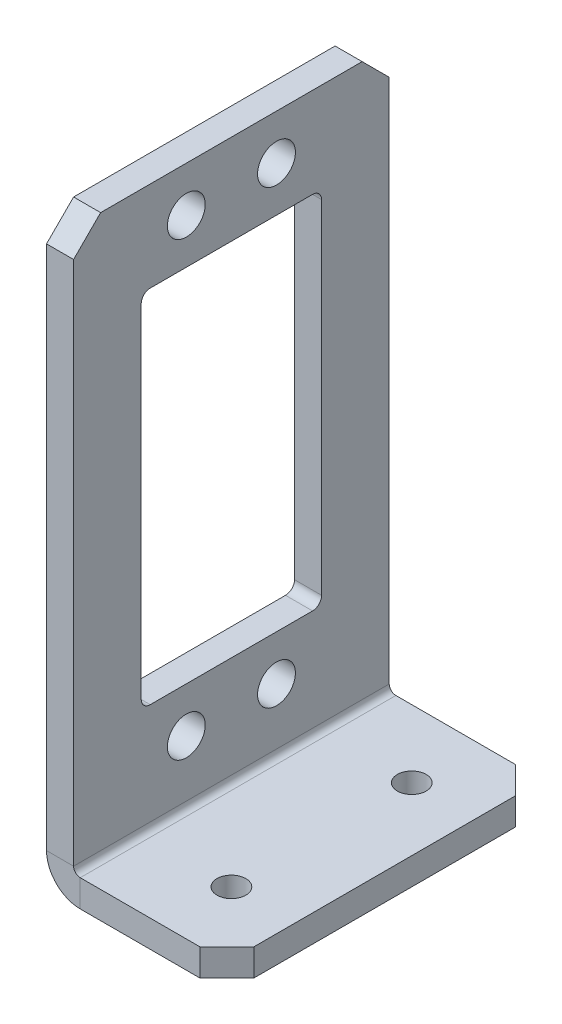
ISO-10303-21;
HEADER;
FILE_DESCRIPTION(('STEP AP214'),'2;1');
FILE_NAME('part.step','',(''),(''),'','','');
FILE_SCHEMA(('AUTOMOTIVE_DESIGN { 1 0 10303 214 1 1 1 1 }'));
ENDSEC;
DATA;
#1=APPLICATION_CONTEXT('core data for automotive mechanical design processes');
#2=APPLICATION_PROTOCOL_DEFINITION('international standard','automotive_design',2000,#1);
#3=PRODUCT_CONTEXT('',#1,'mechanical');
#4=PRODUCT('Part','Part','',(#3));
#5=PRODUCT_RELATED_PRODUCT_CATEGORY('part','',(#4));
#6=PRODUCT_DEFINITION_FORMATION('','',#4);
#7=PRODUCT_DEFINITION_CONTEXT('part definition',#1,'design');
#8=PRODUCT_DEFINITION('design','',#6,#7);
#9=PRODUCT_DEFINITION_SHAPE('','',#8);
#10=(LENGTH_UNIT() NAMED_UNIT(*) SI_UNIT(.MILLI.,.METRE.));
#11=(NAMED_UNIT(*) PLANE_ANGLE_UNIT() SI_UNIT($,.RADIAN.));
#12=(NAMED_UNIT(*) SI_UNIT($,.STERADIAN.) SOLID_ANGLE_UNIT());
#13=UNCERTAINTY_MEASURE_WITH_UNIT(LENGTH_MEASURE(1.E-05),#10,'distance_accuracy_value','');
#14=(GEOMETRIC_REPRESENTATION_CONTEXT(3) GLOBAL_UNCERTAINTY_ASSIGNED_CONTEXT((#13)) GLOBAL_UNIT_ASSIGNED_CONTEXT((#10,
#11,#12)) REPRESENTATION_CONTEXT('',''));
#15=CARTESIAN_POINT('',(0.,0.,0.));
#16=DIRECTION('',(0.,0.,1.));
#17=DIRECTION('',(1.,0.,0.));
#18=AXIS2_PLACEMENT_3D('',#15,#16,#17);
#19=CARTESIAN_POINT('',(20.,9.99999999999999,22.5));
#20=DIRECTION('',(-1.,0.,0.));
#21=DIRECTION('',(0.,0.,1.));
#22=AXIS2_PLACEMENT_3D('',#19,#20,#21);
#23=CYLINDRICAL_SURFACE('',#22,2.1);
#24=CARTESIAN_POINT('',(0.,9.99999999999999,22.5));
#25=DIRECTION('',(-1.,0.,0.));
#26=DIRECTION('',(0.,0.,1.));
#27=AXIS2_PLACEMENT_3D('',#24,#25,#26);
#28=CIRCLE('',#27,2.1);
#29=CARTESIAN_POINT('',(0.,9.99999999999999,24.6));
#30=VERTEX_POINT('',#29);
#31=EDGE_CURVE('E306',#30,#30,#28,.T.);
#32=ORIENTED_EDGE('',*,*,#31,.T.);
#33=EDGE_LOOP('',(#32));
#34=FACE_BOUND('',#33,.T.);
#35=CARTESIAN_POINT('',(3.,9.99999999999999,22.5));
#36=DIRECTION('',(-1.,0.,0.));
#37=DIRECTION('',(0.,0.,1.));
#38=AXIS2_PLACEMENT_3D('',#35,#36,#37);
#39=CIRCLE('',#38,2.1);
#40=CARTESIAN_POINT('',(3.,9.99999999999999,24.6));
#41=VERTEX_POINT('',#40);
#42=EDGE_CURVE('E309',#41,#41,#39,.T.);
#43=ORIENTED_EDGE('',*,*,#42,.F.);
#44=EDGE_LOOP('',(#43));
#45=FACE_BOUND('',#44,.T.);
#46=ADVANCED_FACE('F41',(#34,#45),#23,.F.);
#47=CARTESIAN_POINT('',(20.,9.99999999999999,12.5));
#48=DIRECTION('',(-1.,0.,0.));
#49=DIRECTION('',(0.,0.,1.));
#50=AXIS2_PLACEMENT_3D('',#47,#48,#49);
#51=CYLINDRICAL_SURFACE('',#50,2.1);
#52=CARTESIAN_POINT('',(0.,9.99999999999999,12.5));
#53=DIRECTION('',(-1.,0.,0.));
#54=DIRECTION('',(0.,0.,1.));
#55=AXIS2_PLACEMENT_3D('',#52,#53,#54);
#56=CIRCLE('',#55,2.1);
#57=CARTESIAN_POINT('',(0.,9.99999999999999,14.6));
#58=VERTEX_POINT('',#57);
#59=EDGE_CURVE('E300',#58,#58,#56,.T.);
#60=ORIENTED_EDGE('',*,*,#59,.T.);
#61=EDGE_LOOP('',(#60));
#62=FACE_BOUND('',#61,.T.);
#63=CARTESIAN_POINT('',(3.,9.99999999999999,12.5));
#64=DIRECTION('',(-1.,0.,0.));
#65=DIRECTION('',(0.,0.,1.));
#66=AXIS2_PLACEMENT_3D('',#63,#64,#65);
#67=CIRCLE('',#66,2.1);
#68=CARTESIAN_POINT('',(3.,9.99999999999999,14.6));
#69=VERTEX_POINT('',#68);
#70=EDGE_CURVE('E303',#69,#69,#67,.T.);
#71=ORIENTED_EDGE('',*,*,#70,.F.);
#72=EDGE_LOOP('',(#71));
#73=FACE_BOUND('',#72,.T.);
#74=ADVANCED_FACE('F426',(#62,#73),#51,.F.);
#75=CARTESIAN_POINT('',(0.,3.7366,35.));
#76=DIRECTION('',(0.,0.,1.));
#77=DIRECTION('',(1.,0.,0.));
#78=AXIS2_PLACEMENT_3D('',#75,#76,#77);
#79=PLANE('',#78);
#80=DIRECTION('',(1.,0.,0.));
#81=VECTOR('',#80,1.);
#82=CARTESIAN_POINT('',(0.,3.7366,35.));
#83=LINE('',#82,#81);
#84=CARTESIAN_POINT('',(0.,3.7366,35.));
#85=VERTEX_POINT('',#84);
#86=CARTESIAN_POINT('',(3.,3.7366,35.));
#87=VERTEX_POINT('',#86);
#88=EDGE_CURVE('E179',#85,#87,#83,.T.);
#89=ORIENTED_EDGE('',*,*,#88,.F.);
#90=CARTESIAN_POINT('',(3.7366,3.7366,35.));
#91=DIRECTION('',(0.,0.,1.));
#92=DIRECTION('',(1.,0.,0.));
#93=AXIS2_PLACEMENT_3D('',#90,#91,#92);
#94=CIRCLE('',#93,3.7366);
#95=CARTESIAN_POINT('',(3.7366,0.,35.));
#96=VERTEX_POINT('',#95);
#97=EDGE_CURVE('E184',#96,#85,#94,.F.);
#98=ORIENTED_EDGE('',*,*,#97,.F.);
#99=DIRECTION('',(0.,-1.,0.));
#100=VECTOR('',#99,1.);
#101=CARTESIAN_POINT('',(3.7366,3.,35.));
#102=LINE('',#101,#100);
#103=CARTESIAN_POINT('',(3.7366,3.,35.));
#104=VERTEX_POINT('',#103);
#105=EDGE_CURVE('E192',#104,#96,#102,.T.);
#106=ORIENTED_EDGE('',*,*,#105,.F.);
#107=CARTESIAN_POINT('',(3.7366,3.7366,35.));
#108=DIRECTION('',(0.,0.,1.));
#109=DIRECTION('',(1.,0.,0.));
#110=AXIS2_PLACEMENT_3D('',#107,#108,#109);
#111=CIRCLE('',#110,0.7366);
#112=EDGE_CURVE('E186',#104,#87,#111,.F.);
#113=ORIENTED_EDGE('',*,*,#112,.T.);
#114=EDGE_LOOP('',(#89,#98,#106,#113));
#115=FACE_BOUND('',#114,.T.);
#116=ADVANCED_FACE('F181',(#115),#79,.T.);
#117=CARTESIAN_POINT('',(3.7366,3.,35.));
#118=DIRECTION('',(0.,0.,1.));
#119=DIRECTION('',(1.,0.,0.));
#120=AXIS2_PLACEMENT_3D('',#117,#118,#119);
#121=PLANE('',#120);
#122=DIRECTION('',(0.,1.,0.));
#123=VECTOR('',#122,1.);
#124=CARTESIAN_POINT('',(3.,0.,35.));
#125=LINE('',#124,#123);
#126=CARTESIAN_POINT('',(3.,62.,35.));
#127=VERTEX_POINT('',#126);
#128=EDGE_CURVE('E215',#87,#127,#125,.T.);
#129=ORIENTED_EDGE('',*,*,#128,.T.);
#130=DIRECTION('',(-1.,0.,0.));
#131=VECTOR('',#130,1.);
#132=CARTESIAN_POINT('',(3.7366,62.,35.));
#133=LINE('',#132,#131);
#134=CARTESIAN_POINT('',(0.,62.,35.));
#135=VERTEX_POINT('',#134);
#136=EDGE_CURVE('E214',#127,#135,#133,.T.);
#137=ORIENTED_EDGE('',*,*,#136,.T.);
#138=DIRECTION('',(0.,1.,0.));
#139=VECTOR('',#138,1.);
#140=CARTESIAN_POINT('',(0.,0.,35.));
#141=LINE('',#140,#139);
#142=EDGE_CURVE('E202',#85,#135,#141,.T.);
#143=ORIENTED_EDGE('',*,*,#142,.F.);
#144=ORIENTED_EDGE('',*,*,#88,.T.);
#145=EDGE_LOOP('',(#129,#137,#143,#144));
#146=FACE_BOUND('',#145,.T.);
#147=ADVANCED_FACE('F212',(#146),#121,.T.);
#148=CARTESIAN_POINT('',(3.7366,0.,0.));
#149=DIRECTION('',(0.,0.,-1.));
#150=DIRECTION('',(-1.,0.,0.));
#151=AXIS2_PLACEMENT_3D('',#148,#149,#150);
#152=PLANE('',#151);
#153=DIRECTION('',(0.,1.,0.));
#154=VECTOR('',#153,1.);
#155=CARTESIAN_POINT('',(3.7366,0.,0.));
#156=LINE('',#155,#154);
#157=CARTESIAN_POINT('',(3.7366,0.,0.));
#158=VERTEX_POINT('',#157);
#159=CARTESIAN_POINT('',(3.7366,3.,0.));
#160=VERTEX_POINT('',#159);
#161=EDGE_CURVE('E261',#158,#160,#156,.T.);
#162=ORIENTED_EDGE('',*,*,#161,.F.);
#163=CARTESIAN_POINT('',(3.7366,3.7366,0.));
#164=DIRECTION('',(0.,0.,1.));
#165=DIRECTION('',(1.,0.,0.));
#166=AXIS2_PLACEMENT_3D('',#163,#164,#165);
#167=CIRCLE('',#166,3.7366);
#168=CARTESIAN_POINT('',(0.,3.7366,0.));
#169=VERTEX_POINT('',#168);
#170=EDGE_CURVE('E234',#158,#169,#167,.F.);
#171=ORIENTED_EDGE('',*,*,#170,.T.);
#172=DIRECTION('',(-1.,0.,0.));
#173=VECTOR('',#172,1.);
#174=CARTESIAN_POINT('',(3.,3.7366,0.));
#175=LINE('',#174,#173);
#176=CARTESIAN_POINT('',(3.,3.7366,0.));
#177=VERTEX_POINT('',#176);
#178=EDGE_CURVE('E259',#177,#169,#175,.T.);
#179=ORIENTED_EDGE('',*,*,#178,.F.);
#180=CARTESIAN_POINT('',(3.7366,3.7366,0.));
#181=DIRECTION('',(0.,0.,1.));
#182=DIRECTION('',(1.,0.,0.));
#183=AXIS2_PLACEMENT_3D('',#180,#181,#182);
#184=CIRCLE('',#183,0.7366);
#185=EDGE_CURVE('E240',#160,#177,#184,.F.);
#186=ORIENTED_EDGE('',*,*,#185,.F.);
#187=EDGE_LOOP('',(#162,#171,#179,#186));
#188=FACE_BOUND('',#187,.T.);
#189=ADVANCED_FACE('F413',(#188),#152,.T.);
#190=CARTESIAN_POINT('',(3.,3.7366,0.));
#191=DIRECTION('',(0.,0.,-1.));
#192=DIRECTION('',(-1.,0.,0.));
#193=AXIS2_PLACEMENT_3D('',#190,#191,#192);
#194=PLANE('',#193);
#195=DIRECTION('',(1.,0.,0.));
#196=VECTOR('',#195,1.);
#197=CARTESIAN_POINT('',(0.,3.,0.));
#198=LINE('',#197,#196);
#199=CARTESIAN_POINT('',(17.,3.,0.));
#200=VERTEX_POINT('',#199);
#201=EDGE_CURVE('E238',#200,#160,#198,.F.);
#202=ORIENTED_EDGE('',*,*,#201,.F.);
#203=DIRECTION('',(0.,-1.,0.));
#204=VECTOR('',#203,1.);
#205=CARTESIAN_POINT('',(17.,3.7366,0.));
#206=LINE('',#205,#204);
#207=CARTESIAN_POINT('',(17.,0.,0.));
#208=VERTEX_POINT('',#207);
#209=EDGE_CURVE('E297',#200,#208,#206,.T.);
#210=ORIENTED_EDGE('',*,*,#209,.T.);
#211=DIRECTION('',(-1.,0.,0.));
#212=VECTOR('',#211,1.);
#213=CARTESIAN_POINT('',(0.,0.,0.));
#214=LINE('',#213,#212);
#215=EDGE_CURVE('E236',#208,#158,#214,.T.);
#216=ORIENTED_EDGE('',*,*,#215,.T.);
#217=ORIENTED_EDGE('',*,*,#161,.T.);
#218=EDGE_LOOP('',(#202,#210,#216,#217));
#219=FACE_BOUND('',#218,.T.);
#220=ADVANCED_FACE('F419',(#219),#194,.T.);
#221=CARTESIAN_POINT('',(3.,0.,35.));
#222=DIRECTION('',(-1.,0.,0.));
#223=DIRECTION('',(0.,0.,1.));
#224=AXIS2_PLACEMENT_3D('',#221,#222,#223);
#225=PLANE('',#224);
#226=DIRECTION('',(0.,1.,0.));
#227=VECTOR('',#226,1.);
#228=CARTESIAN_POINT('',(3.,0.,27.5));
#229=LINE('',#228,#227);
#230=CARTESIAN_POINT('',(3.,16.,27.5));
#231=VERTEX_POINT('',#230);
#232=CARTESIAN_POINT('',(3.,54.,27.5));
#233=VERTEX_POINT('',#232);
#234=EDGE_CURVE('E371',#231,#233,#229,.T.);
#235=ORIENTED_EDGE('',*,*,#234,.T.);
#236=CARTESIAN_POINT('',(3.,54.,26.5));
#237=DIRECTION('',(-1.,0.,0.));
#238=DIRECTION('',(0.,0.,1.));
#239=AXIS2_PLACEMENT_3D('',#236,#237,#238);
#240=CIRCLE('',#239,1.);
#241=CARTESIAN_POINT('',(3.,55.,26.5));
#242=VERTEX_POINT('',#241);
#243=EDGE_CURVE('E63',#233,#242,#240,.T.);
#244=ORIENTED_EDGE('',*,*,#243,.T.);
#245=DIRECTION('',(0.,0.,-1.));
#246=VECTOR('',#245,1.);
#247=CARTESIAN_POINT('',(3.,55.,35.));
#248=LINE('',#247,#246);
#249=CARTESIAN_POINT('',(3.,55.,8.50000000000002));
#250=VERTEX_POINT('',#249);
#251=EDGE_CURVE('E362',#242,#250,#248,.T.);
#252=ORIENTED_EDGE('',*,*,#251,.T.);
#253=CARTESIAN_POINT('',(3.,54.,8.50000000000002));
#254=DIRECTION('',(-1.,0.,0.));
#255=DIRECTION('',(0.,0.,1.));
#256=AXIS2_PLACEMENT_3D('',#253,#254,#255);
#257=CIRCLE('',#256,1.);
#258=CARTESIAN_POINT('',(3.,54.,7.50000000000002));
#259=VERTEX_POINT('',#258);
#260=EDGE_CURVE('E11',#250,#259,#257,.T.);
#261=ORIENTED_EDGE('',*,*,#260,.T.);
#262=DIRECTION('',(0.,-1.,0.));
#263=VECTOR('',#262,1.);
#264=CARTESIAN_POINT('',(3.,0.,7.50000000000002));
#265=LINE('',#264,#263);
#266=CARTESIAN_POINT('',(3.,16.,7.50000000000002));
#267=VERTEX_POINT('',#266);
#268=EDGE_CURVE('E360',#259,#267,#265,.T.);
#269=ORIENTED_EDGE('',*,*,#268,.T.);
#270=CARTESIAN_POINT('',(3.,16.,8.50000000000002));
#271=DIRECTION('',(-1.,0.,0.));
#272=DIRECTION('',(0.,0.,1.));
#273=AXIS2_PLACEMENT_3D('',#270,#271,#272);
#274=CIRCLE('',#273,1.);
#275=CARTESIAN_POINT('',(3.,15.,8.50000000000002));
#276=VERTEX_POINT('',#275);
#277=EDGE_CURVE('E337',#267,#276,#274,.T.);
#278=ORIENTED_EDGE('',*,*,#277,.T.);
#279=DIRECTION('',(0.,0.,1.));
#280=VECTOR('',#279,1.);
#281=CARTESIAN_POINT('',(3.,15.,35.));
#282=LINE('',#281,#280);
#283=CARTESIAN_POINT('',(3.,15.,26.5));
#284=VERTEX_POINT('',#283);
#285=EDGE_CURVE('E352',#276,#284,#282,.T.);
#286=ORIENTED_EDGE('',*,*,#285,.T.);
#287=CARTESIAN_POINT('',(3.,16.,26.5));
#288=DIRECTION('',(-1.,0.,0.));
#289=DIRECTION('',(0.,0.,1.));
#290=AXIS2_PLACEMENT_3D('',#287,#288,#289);
#291=CIRCLE('',#290,1.);
#292=EDGE_CURVE('E333',#284,#231,#291,.T.);
#293=ORIENTED_EDGE('',*,*,#292,.T.);
#294=EDGE_LOOP('',(#235,#244,#252,#261,#269,#278,#286,#293));
#295=FACE_BOUND('',#294,.T.);
#296=CARTESIAN_POINT('',(3.,60.,22.5));
#297=DIRECTION('',(-1.,0.,0.));
#298=DIRECTION('',(0.,0.,1.));
#299=AXIS2_PLACEMENT_3D('',#296,#297,#298);
#300=CIRCLE('',#299,2.1);
#301=CARTESIAN_POINT('',(3.,60.,24.6));
#302=VERTEX_POINT('',#301);
#303=EDGE_CURVE('E369',#302,#302,#300,.T.);
#304=ORIENTED_EDGE('',*,*,#303,.T.);
#305=EDGE_LOOP('',(#304));
#306=FACE_BOUND('',#305,.T.);
#307=CARTESIAN_POINT('',(3.,60.,12.5));
#308=DIRECTION('',(-1.,0.,0.));
#309=DIRECTION('',(0.,0.,1.));
#310=AXIS2_PLACEMENT_3D('',#307,#308,#309);
#311=CIRCLE('',#310,2.1);
#312=CARTESIAN_POINT('',(3.,60.,14.6));
#313=VERTEX_POINT('',#312);
#314=EDGE_CURVE('E380',#313,#313,#311,.T.);
#315=ORIENTED_EDGE('',*,*,#314,.T.);
#316=EDGE_LOOP('',(#315));
#317=FACE_BOUND('',#316,.T.);
#318=DIRECTION('',(0.,1.,0.));
#319=VECTOR('',#318,1.);
#320=CARTESIAN_POINT('',(3.,0.,0.));
#321=LINE('',#320,#319);
#322=CARTESIAN_POINT('',(3.,62.,0.));
#323=VERTEX_POINT('',#322);
#324=EDGE_CURVE('E229',#177,#323,#321,.T.);
#325=ORIENTED_EDGE('',*,*,#324,.T.);
#326=DIRECTION('',(0.,0.707106781186545,0.70710678118655));
#327=VECTOR('',#326,1.);
#328=CARTESIAN_POINT('',(3.,62.,0.));
#329=LINE('',#328,#327);
#330=CARTESIAN_POINT('',(3.,65.,3.00000000000001));
#331=VERTEX_POINT('',#330);
#332=EDGE_CURVE('E270',#323,#331,#329,.T.);
#333=ORIENTED_EDGE('',*,*,#332,.T.);
#334=DIRECTION('',(0.,0.,-1.));
#335=VECTOR('',#334,1.);
#336=CARTESIAN_POINT('',(3.,65.,35.));
#337=LINE('',#336,#335);
#338=CARTESIAN_POINT('',(3.,65.,32.));
#339=VERTEX_POINT('',#338);
#340=EDGE_CURVE('E256',#339,#331,#337,.T.);
#341=ORIENTED_EDGE('',*,*,#340,.F.);
#342=DIRECTION('',(0.,0.70710678118655,-0.707106781186545));
#343=VECTOR('',#342,1.);
#344=CARTESIAN_POINT('',(3.,65.,32.));
#345=LINE('',#344,#343);
#346=EDGE_CURVE('E268',#339,#127,#345,.F.);
#347=ORIENTED_EDGE('',*,*,#346,.T.);
#348=ORIENTED_EDGE('',*,*,#128,.F.);
#349=DIRECTION('',(0.,0.,-1.));
#350=VECTOR('',#349,1.);
#351=CARTESIAN_POINT('',(3.,3.7366,35.));
#352=LINE('',#351,#350);
#353=EDGE_CURVE('E228',#87,#177,#352,.T.);
#354=ORIENTED_EDGE('',*,*,#353,.T.);
#355=EDGE_LOOP('',(#325,#333,#341,#347,#348,#354));
#356=FACE_BOUND('',#355,.T.);
#357=ORIENTED_EDGE('',*,*,#70,.T.);
#358=EDGE_LOOP('',(#357));
#359=FACE_BOUND('',#358,.T.);
#360=ORIENTED_EDGE('',*,*,#42,.T.);
#361=EDGE_LOOP('',(#360));
#362=FACE_BOUND('',#361,.T.);
#363=ADVANCED_FACE('F358',(#295,#306,#317,#356,#359,#362),#225,.F.);
#364=CARTESIAN_POINT('',(0.,65.,35.));
#365=DIRECTION('',(0.,1.,0.));
#366=DIRECTION('',(0.,0.,1.));
#367=AXIS2_PLACEMENT_3D('',#364,#365,#366);
#368=PLANE('',#367);
#369=ORIENTED_EDGE('',*,*,#340,.T.);
#370=DIRECTION('',(-1.,0.,0.));
#371=VECTOR('',#370,1.);
#372=CARTESIAN_POINT('',(0.,65.,3.00000000000001));
#373=LINE('',#372,#371);
#374=CARTESIAN_POINT('',(0.,65.,3.00000000000001));
#375=VERTEX_POINT('',#374);
#376=EDGE_CURVE('E275',#331,#375,#373,.T.);
#377=ORIENTED_EDGE('',*,*,#376,.T.);
#378=DIRECTION('',(0.,0.,-1.));
#379=VECTOR('',#378,1.);
#380=CARTESIAN_POINT('',(0.,65.,35.));
#381=LINE('',#380,#379);
#382=CARTESIAN_POINT('',(0.,65.,32.));
#383=VERTEX_POINT('',#382);
#384=EDGE_CURVE('E209',#383,#375,#381,.T.);
#385=ORIENTED_EDGE('',*,*,#384,.F.);
#386=DIRECTION('',(1.,0.,0.));
#387=VECTOR('',#386,1.);
#388=CARTESIAN_POINT('',(0.,65.,32.));
#389=LINE('',#388,#387);
#390=EDGE_CURVE('E272',#383,#339,#389,.T.);
#391=ORIENTED_EDGE('',*,*,#390,.T.);
#392=EDGE_LOOP('',(#369,#377,#385,#391));
#393=FACE_BOUND('',#392,.T.);
#394=ADVANCED_FACE('F401',(#393),#368,.T.);
#395=CARTESIAN_POINT('',(0.,0.,35.));
#396=DIRECTION('',(-1.,0.,0.));
#397=DIRECTION('',(0.,0.,1.));
#398=AXIS2_PLACEMENT_3D('',#395,#396,#397);
#399=PLANE('',#398);
#400=DIRECTION('',(0.,-1.,0.));
#401=VECTOR('',#400,1.);
#402=CARTESIAN_POINT('',(0.,15.,7.50000000000002));
#403=LINE('',#402,#401);
#404=CARTESIAN_POINT('',(0.,54.,7.50000000000002));
#405=VERTEX_POINT('',#404);
#406=CARTESIAN_POINT('',(0.,16.,7.50000000000002));
#407=VERTEX_POINT('',#406);
#408=EDGE_CURVE('E347',#405,#407,#403,.T.);
#409=ORIENTED_EDGE('',*,*,#408,.F.);
#410=CARTESIAN_POINT('',(0.,54.,8.50000000000002));
#411=DIRECTION('',(-1.,0.,0.));
#412=DIRECTION('',(0.,0.,1.));
#413=AXIS2_PLACEMENT_3D('',#410,#411,#412);
#414=CIRCLE('',#413,1.);
#415=CARTESIAN_POINT('',(0.,55.,8.50000000000002));
#416=VERTEX_POINT('',#415);
#417=EDGE_CURVE('E49',#405,#416,#414,.F.);
#418=ORIENTED_EDGE('',*,*,#417,.T.);
#419=DIRECTION('',(0.,0.,-1.));
#420=VECTOR('',#419,1.);
#421=CARTESIAN_POINT('',(0.,55.,27.5));
#422=LINE('',#421,#420);
#423=CARTESIAN_POINT('',(0.,55.,26.5));
#424=VERTEX_POINT('',#423);
#425=EDGE_CURVE('E345',#424,#416,#422,.T.);
#426=ORIENTED_EDGE('',*,*,#425,.F.);
#427=CARTESIAN_POINT('',(0.,54.,26.5));
#428=DIRECTION('',(-1.,0.,0.));
#429=DIRECTION('',(0.,0.,1.));
#430=AXIS2_PLACEMENT_3D('',#427,#428,#429);
#431=CIRCLE('',#430,1.);
#432=CARTESIAN_POINT('',(0.,54.,27.5));
#433=VERTEX_POINT('',#432);
#434=EDGE_CURVE('E339',#424,#433,#431,.F.);
#435=ORIENTED_EDGE('',*,*,#434,.T.);
#436=DIRECTION('',(0.,1.,0.));
#437=VECTOR('',#436,1.);
#438=CARTESIAN_POINT('',(0.,15.,27.5));
#439=LINE('',#438,#437);
#440=CARTESIAN_POINT('',(0.,16.,27.5));
#441=VERTEX_POINT('',#440);
#442=EDGE_CURVE('E353',#441,#433,#439,.T.);
#443=ORIENTED_EDGE('',*,*,#442,.F.);
#444=CARTESIAN_POINT('',(0.,16.,26.5));
#445=DIRECTION('',(-1.,0.,0.));
#446=DIRECTION('',(0.,0.,1.));
#447=AXIS2_PLACEMENT_3D('',#444,#445,#446);
#448=CIRCLE('',#447,1.);
#449=CARTESIAN_POINT('',(0.,15.,26.5));
#450=VERTEX_POINT('',#449);
#451=EDGE_CURVE('E331',#441,#450,#448,.F.);
#452=ORIENTED_EDGE('',*,*,#451,.T.);
#453=DIRECTION('',(0.,0.,1.));
#454=VECTOR('',#453,1.);
#455=CARTESIAN_POINT('',(0.,15.,27.5));
#456=LINE('',#455,#454);
#457=CARTESIAN_POINT('',(0.,15.,8.50000000000002));
#458=VERTEX_POINT('',#457);
#459=EDGE_CURVE('E457',#458,#450,#456,.T.);
#460=ORIENTED_EDGE('',*,*,#459,.F.);
#461=CARTESIAN_POINT('',(0.,16.,8.50000000000002));
#462=DIRECTION('',(-1.,0.,0.));
#463=DIRECTION('',(0.,0.,1.));
#464=AXIS2_PLACEMENT_3D('',#461,#462,#463);
#465=CIRCLE('',#464,1.);
#466=EDGE_CURVE('E335',#458,#407,#465,.F.);
#467=ORIENTED_EDGE('',*,*,#466,.T.);
#468=EDGE_LOOP('',(#409,#418,#426,#435,#443,#452,#460,#467));
#469=FACE_BOUND('',#468,.T.);
#470=CARTESIAN_POINT('',(0.,60.,22.5));
#471=DIRECTION('',(-1.,0.,0.));
#472=DIRECTION('',(0.,0.,1.));
#473=AXIS2_PLACEMENT_3D('',#470,#471,#472);
#474=CIRCLE('',#473,2.1);
#475=CARTESIAN_POINT('',(0.,60.,24.6));
#476=VERTEX_POINT('',#475);
#477=EDGE_CURVE('E366',#476,#476,#474,.T.);
#478=ORIENTED_EDGE('',*,*,#477,.F.);
#479=EDGE_LOOP('',(#478));
#480=FACE_BOUND('',#479,.T.);
#481=CARTESIAN_POINT('',(0.,60.,12.5));
#482=DIRECTION('',(-1.,0.,0.));
#483=DIRECTION('',(0.,0.,1.));
#484=AXIS2_PLACEMENT_3D('',#481,#482,#483);
#485=CIRCLE('',#484,2.1);
#486=CARTESIAN_POINT('',(0.,60.,14.6));
#487=VERTEX_POINT('',#486);
#488=EDGE_CURVE('E377',#487,#487,#485,.T.);
#489=ORIENTED_EDGE('',*,*,#488,.F.);
#490=EDGE_LOOP('',(#489));
#491=FACE_BOUND('',#490,.T.);
#492=ORIENTED_EDGE('',*,*,#384,.T.);
#493=DIRECTION('',(0.,-0.707106781186545,-0.70710678118655));
#494=VECTOR('',#493,1.);
#495=CARTESIAN_POINT('',(0.,48.5000000000002,-13.4999999999999));
#496=LINE('',#495,#494);
#497=CARTESIAN_POINT('',(0.,62.,0.));
#498=VERTEX_POINT('',#497);
#499=EDGE_CURVE('E279',#375,#498,#496,.T.);
#500=ORIENTED_EDGE('',*,*,#499,.T.);
#501=DIRECTION('',(0.,1.,0.));
#502=VECTOR('',#501,1.);
#503=CARTESIAN_POINT('',(0.,0.,0.));
#504=LINE('',#503,#502);
#505=EDGE_CURVE('E205',#169,#498,#504,.T.);
#506=ORIENTED_EDGE('',*,*,#505,.F.);
#507=DIRECTION('',(0.,0.,-1.));
#508=VECTOR('',#507,1.);
#509=CARTESIAN_POINT('',(0.,3.7366,35.));
#510=LINE('',#509,#508);
#511=EDGE_CURVE('E198',#85,#169,#510,.T.);
#512=ORIENTED_EDGE('',*,*,#511,.F.);
#513=ORIENTED_EDGE('',*,*,#142,.T.);
#514=DIRECTION('',(0.,-0.70710678118655,0.707106781186545));
#515=VECTOR('',#514,1.);
#516=CARTESIAN_POINT('',(0.,30.9999999999998,66.));
#517=LINE('',#516,#515);
#518=EDGE_CURVE('E277',#135,#383,#517,.F.);
#519=ORIENTED_EDGE('',*,*,#518,.T.);
#520=EDGE_LOOP('',(#492,#500,#506,#512,#513,#519));
#521=FACE_BOUND('',#520,.T.);
#522=ORIENTED_EDGE('',*,*,#59,.F.);
#523=EDGE_LOOP('',(#522));
#524=FACE_BOUND('',#523,.T.);
#525=ORIENTED_EDGE('',*,*,#31,.F.);
#526=EDGE_LOOP('',(#525));
#527=FACE_BOUND('',#526,.T.);
#528=ADVANCED_FACE('F200',(#469,#480,#491,#521,#524,#527),#399,.T.);
#529=CARTESIAN_POINT('',(3.7366,3.7366,35.));
#530=DIRECTION('',(0.,0.,-1.));
#531=DIRECTION('',(-1.,0.,0.));
#532=AXIS2_PLACEMENT_3D('',#529,#530,#531);
#533=CYLINDRICAL_SURFACE('',#532,3.7366);
#534=ORIENTED_EDGE('',*,*,#170,.F.);
#535=DIRECTION('',(0.,0.,-1.));
#536=VECTOR('',#535,1.);
#537=CARTESIAN_POINT('',(3.7366,0.,35.));
#538=LINE('',#537,#536);
#539=EDGE_CURVE('E210',#96,#158,#538,.T.);
#540=ORIENTED_EDGE('',*,*,#539,.F.);
#541=ORIENTED_EDGE('',*,*,#97,.T.);
#542=ORIENTED_EDGE('',*,*,#511,.T.);
#543=EDGE_LOOP('',(#534,#540,#541,#542));
#544=FACE_BOUND('',#543,.T.);
#545=ADVANCED_FACE('F218',(#544),#533,.T.);
#546=CARTESIAN_POINT('',(0.,0.,35.));
#547=DIRECTION('',(0.,-1.,0.));
#548=DIRECTION('',(0.,0.,-1.));
#549=AXIS2_PLACEMENT_3D('',#546,#547,#548);
#550=PLANE('',#549);
#551=CARTESIAN_POINT('',(13.,0.,27.5));
#552=DIRECTION('',(0.,1.,0.));
#553=DIRECTION('',(0.,0.,1.));
#554=AXIS2_PLACEMENT_3D('',#551,#552,#553);
#555=CIRCLE('',#554,1.6);
#556=CARTESIAN_POINT('',(13.,0.,29.1));
#557=VERTEX_POINT('',#556);
#558=EDGE_CURVE('E384',#557,#557,#555,.T.);
#559=ORIENTED_EDGE('',*,*,#558,.T.);
#560=EDGE_LOOP('',(#559));
#561=FACE_BOUND('',#560,.T.);
#562=CARTESIAN_POINT('',(13.,0.,7.5));
#563=DIRECTION('',(0.,1.,0.));
#564=DIRECTION('',(0.,0.,1.));
#565=AXIS2_PLACEMENT_3D('',#562,#563,#564);
#566=CIRCLE('',#565,1.6);
#567=CARTESIAN_POINT('',(13.,0.,9.1));
#568=VERTEX_POINT('',#567);
#569=EDGE_CURVE('E232',#568,#568,#566,.T.);
#570=ORIENTED_EDGE('',*,*,#569,.T.);
#571=EDGE_LOOP('',(#570));
#572=FACE_BOUND('',#571,.T.);
#573=DIRECTION('',(0.,0.,-1.));
#574=VECTOR('',#573,1.);
#575=CARTESIAN_POINT('',(20.,0.,35.));
#576=LINE('',#575,#574);
#577=CARTESIAN_POINT('',(20.,0.,32.));
#578=VERTEX_POINT('',#577);
#579=CARTESIAN_POINT('',(20.,0.,3.00000000000002));
#580=VERTEX_POINT('',#579);
#581=EDGE_CURVE('E251',#578,#580,#576,.T.);
#582=ORIENTED_EDGE('',*,*,#581,.F.);
#583=DIRECTION('',(0.707106781186549,0.,-0.707106781186546));
#584=VECTOR('',#583,1.);
#585=CARTESIAN_POINT('',(8.49999999999996,0.,43.5));
#586=LINE('',#585,#584);
#587=CARTESIAN_POINT('',(17.,0.,35.));
#588=VERTEX_POINT('',#587);
#589=EDGE_CURVE('E289',#578,#588,#586,.F.);
#590=ORIENTED_EDGE('',*,*,#589,.T.);
#591=DIRECTION('',(-1.,0.,0.));
#592=VECTOR('',#591,1.);
#593=CARTESIAN_POINT('',(0.,0.,35.));
#594=LINE('',#593,#592);
#595=EDGE_CURVE('E220',#588,#96,#594,.T.);
#596=ORIENTED_EDGE('',*,*,#595,.T.);
#597=ORIENTED_EDGE('',*,*,#539,.T.);
#598=ORIENTED_EDGE('',*,*,#215,.F.);
#599=DIRECTION('',(-0.707106781186547,0.,-0.707106781186548));
#600=VECTOR('',#599,1.);
#601=CARTESIAN_POINT('',(26.,0.,9.00000000000005));
#602=LINE('',#601,#600);
#603=EDGE_CURVE('E287',#208,#580,#602,.F.);
#604=ORIENTED_EDGE('',*,*,#603,.T.);
#605=EDGE_LOOP('',(#582,#590,#596,#597,#598,#604));
#606=FACE_BOUND('',#605,.T.);
#607=ADVANCED_FACE('F512',(#561,#572,#606),#550,.T.);
#608=CARTESIAN_POINT('',(20.,3.,35.));
#609=DIRECTION('',(1.,0.,0.));
#610=DIRECTION('',(0.,0.,-1.));
#611=AXIS2_PLACEMENT_3D('',#608,#609,#610);
#612=PLANE('',#611);
#613=DIRECTION('',(0.,0.,-1.));
#614=VECTOR('',#613,1.);
#615=CARTESIAN_POINT('',(20.,3.,35.));
#616=LINE('',#615,#614);
#617=CARTESIAN_POINT('',(20.,3.,32.));
#618=VERTEX_POINT('',#617);
#619=CARTESIAN_POINT('',(20.,3.,3.00000000000002));
#620=VERTEX_POINT('',#619);
#621=EDGE_CURVE('E248',#618,#620,#616,.T.);
#622=ORIENTED_EDGE('',*,*,#621,.F.);
#623=DIRECTION('',(0.,-1.,0.));
#624=VECTOR('',#623,1.);
#625=CARTESIAN_POINT('',(20.,3.,32.));
#626=LINE('',#625,#624);
#627=EDGE_CURVE('E284',#618,#578,#626,.T.);
#628=ORIENTED_EDGE('',*,*,#627,.T.);
#629=ORIENTED_EDGE('',*,*,#581,.T.);
#630=DIRECTION('',(0.,1.,0.));
#631=VECTOR('',#630,1.);
#632=CARTESIAN_POINT('',(20.,3.,3.00000000000002));
#633=LINE('',#632,#631);
#634=EDGE_CURVE('E282',#580,#620,#633,.T.);
#635=ORIENTED_EDGE('',*,*,#634,.T.);
#636=EDGE_LOOP('',(#622,#628,#629,#635));
#637=FACE_BOUND('',#636,.T.);
#638=ADVANCED_FACE('F508',(#637),#612,.T.);
#639=CARTESIAN_POINT('',(0.,3.,35.));
#640=DIRECTION('',(0.,-1.,0.));
#641=DIRECTION('',(0.,0.,-1.));
#642=AXIS2_PLACEMENT_3D('',#639,#640,#641);
#643=PLANE('',#642);
#644=CARTESIAN_POINT('',(13.,3.,27.5));
#645=DIRECTION('',(0.,1.,0.));
#646=DIRECTION('',(0.,0.,1.));
#647=AXIS2_PLACEMENT_3D('',#644,#645,#646);
#648=CIRCLE('',#647,1.6);
#649=CARTESIAN_POINT('',(13.,3.,29.1));
#650=VERTEX_POINT('',#649);
#651=EDGE_CURVE('E383',#650,#650,#648,.T.);
#652=ORIENTED_EDGE('',*,*,#651,.F.);
#653=EDGE_LOOP('',(#652));
#654=FACE_BOUND('',#653,.T.);
#655=CARTESIAN_POINT('',(13.,3.,7.5));
#656=DIRECTION('',(0.,1.,0.));
#657=DIRECTION('',(0.,0.,1.));
#658=AXIS2_PLACEMENT_3D('',#655,#656,#657);
#659=CIRCLE('',#658,1.6);
#660=CARTESIAN_POINT('',(13.,3.,9.1));
#661=VERTEX_POINT('',#660);
#662=EDGE_CURVE('E387',#661,#661,#659,.T.);
#663=ORIENTED_EDGE('',*,*,#662,.F.);
#664=EDGE_LOOP('',(#663));
#665=FACE_BOUND('',#664,.T.);
#666=DIRECTION('',(1.,0.,0.));
#667=VECTOR('',#666,1.);
#668=CARTESIAN_POINT('',(0.,3.,35.));
#669=LINE('',#668,#667);
#670=CARTESIAN_POINT('',(17.,3.,35.));
#671=VERTEX_POINT('',#670);
#672=EDGE_CURVE('E222',#671,#104,#669,.F.);
#673=ORIENTED_EDGE('',*,*,#672,.F.);
#674=DIRECTION('',(-0.707106781186549,0.,0.707106781186546));
#675=VECTOR('',#674,1.);
#676=CARTESIAN_POINT('',(20.,3.,32.));
#677=LINE('',#676,#675);
#678=EDGE_CURVE('E295',#671,#618,#677,.F.);
#679=ORIENTED_EDGE('',*,*,#678,.T.);
#680=ORIENTED_EDGE('',*,*,#621,.T.);
#681=DIRECTION('',(0.707106781186547,0.,0.707106781186548));
#682=VECTOR('',#681,1.);
#683=CARTESIAN_POINT('',(17.,3.,0.));
#684=LINE('',#683,#682);
#685=EDGE_CURVE('E293',#620,#200,#684,.F.);
#686=ORIENTED_EDGE('',*,*,#685,.T.);
#687=ORIENTED_EDGE('',*,*,#201,.T.);
#688=DIRECTION('',(0.,0.,-1.));
#689=VECTOR('',#688,1.);
#690=CARTESIAN_POINT('',(3.7366,3.,35.));
#691=LINE('',#690,#689);
#692=EDGE_CURVE('E245',#104,#160,#691,.T.);
#693=ORIENTED_EDGE('',*,*,#692,.F.);
#694=EDGE_LOOP('',(#673,#679,#680,#686,#687,#693));
#695=FACE_BOUND('',#694,.T.);
#696=ADVANCED_FACE('F505',(#654,#665,#695),#643,.F.);
#697=CARTESIAN_POINT('',(3.7366,3.7366,35.));
#698=DIRECTION('',(0.,0.,-1.));
#699=DIRECTION('',(-1.,0.,0.));
#700=AXIS2_PLACEMENT_3D('',#697,#698,#699);
#701=CYLINDRICAL_SURFACE('',#700,0.7366);
#702=ORIENTED_EDGE('',*,*,#185,.T.);
#703=ORIENTED_EDGE('',*,*,#353,.F.);
#704=ORIENTED_EDGE('',*,*,#112,.F.);
#705=ORIENTED_EDGE('',*,*,#692,.T.);
#706=EDGE_LOOP('',(#702,#703,#704,#705));
#707=FACE_BOUND('',#706,.T.);
#708=ADVANCED_FACE('F415',(#707),#701,.F.);
#709=CARTESIAN_POINT('',(3.7366,3.7366,35.));
#710=DIRECTION('',(0.,0.,1.));
#711=DIRECTION('',(1.,0.,0.));
#712=AXIS2_PLACEMENT_3D('',#709,#710,#711);
#713=PLANE('',#712);
#714=ORIENTED_EDGE('',*,*,#595,.F.);
#715=DIRECTION('',(0.,1.,0.));
#716=VECTOR('',#715,1.);
#717=CARTESIAN_POINT('',(17.,3.7366,35.));
#718=LINE('',#717,#716);
#719=EDGE_CURVE('E291',#588,#671,#718,.T.);
#720=ORIENTED_EDGE('',*,*,#719,.T.);
#721=ORIENTED_EDGE('',*,*,#672,.T.);
#722=ORIENTED_EDGE('',*,*,#105,.T.);
#723=EDGE_LOOP('',(#714,#720,#721,#722));
#724=FACE_BOUND('',#723,.T.);
#725=ADVANCED_FACE('F497',(#724),#713,.T.);
#726=CARTESIAN_POINT('',(3.7366,3.7366,0.));
#727=DIRECTION('',(0.,0.,1.));
#728=DIRECTION('',(1.,0.,0.));
#729=AXIS2_PLACEMENT_3D('',#726,#727,#728);
#730=PLANE('',#729);
#731=ORIENTED_EDGE('',*,*,#505,.T.);
#732=DIRECTION('',(1.,0.,0.));
#733=VECTOR('',#732,1.);
#734=CARTESIAN_POINT('',(3.,62.,0.));
#735=LINE('',#734,#733);
#736=EDGE_CURVE('E191',#498,#323,#735,.T.);
#737=ORIENTED_EDGE('',*,*,#736,.T.);
#738=ORIENTED_EDGE('',*,*,#324,.F.);
#739=ORIENTED_EDGE('',*,*,#178,.T.);
#740=EDGE_LOOP('',(#731,#737,#738,#739));
#741=FACE_BOUND('',#740,.T.);
#742=ADVANCED_FACE('F408',(#741),#730,.F.);
#743=CARTESIAN_POINT('',(13.,0.,7.5));
#744=DIRECTION('',(0.,1.,0.));
#745=DIRECTION('',(0.,0.,1.));
#746=AXIS2_PLACEMENT_3D('',#743,#744,#745);
#747=CYLINDRICAL_SURFACE('',#746,1.6);
#748=ORIENTED_EDGE('',*,*,#569,.F.);
#749=EDGE_LOOP('',(#748));
#750=FACE_BOUND('',#749,.T.);
#751=ORIENTED_EDGE('',*,*,#662,.T.);
#752=EDGE_LOOP('',(#751));
#753=FACE_BOUND('',#752,.T.);
#754=ADVANCED_FACE('F492',(#750,#753),#747,.F.);
#755=CARTESIAN_POINT('',(13.,0.,27.5));
#756=DIRECTION('',(0.,1.,0.));
#757=DIRECTION('',(0.,0.,1.));
#758=AXIS2_PLACEMENT_3D('',#755,#756,#757);
#759=CYLINDRICAL_SURFACE('',#758,1.6);
#760=ORIENTED_EDGE('',*,*,#558,.F.);
#761=EDGE_LOOP('',(#760));
#762=FACE_BOUND('',#761,.T.);
#763=ORIENTED_EDGE('',*,*,#651,.T.);
#764=EDGE_LOOP('',(#763));
#765=FACE_BOUND('',#764,.T.);
#766=ADVANCED_FACE('F489',(#762,#765),#759,.F.);
#767=CARTESIAN_POINT('',(3.7366,62.,0.));
#768=DIRECTION('',(0.,0.70710678118655,-0.707106781186545));
#769=DIRECTION('',(-1.,0.,0.));
#770=AXIS2_PLACEMENT_3D('',#767,#768,#769);
#771=PLANE('',#770);
#772=ORIENTED_EDGE('',*,*,#499,.F.);
#773=ORIENTED_EDGE('',*,*,#376,.F.);
#774=ORIENTED_EDGE('',*,*,#332,.F.);
#775=ORIENTED_EDGE('',*,*,#736,.F.);
#776=EDGE_LOOP('',(#772,#773,#774,#775));
#777=FACE_BOUND('',#776,.T.);
#778=ADVANCED_FACE('F405',(#777),#771,.T.);
#779=CARTESIAN_POINT('',(0.,65.,32.));
#780=DIRECTION('',(0.,-0.707106781186545,-0.70710678118655));
#781=DIRECTION('',(1.,0.,0.));
#782=AXIS2_PLACEMENT_3D('',#779,#780,#781);
#783=PLANE('',#782);
#784=ORIENTED_EDGE('',*,*,#518,.F.);
#785=ORIENTED_EDGE('',*,*,#136,.F.);
#786=ORIENTED_EDGE('',*,*,#346,.F.);
#787=ORIENTED_EDGE('',*,*,#390,.F.);
#788=EDGE_LOOP('',(#784,#785,#786,#787));
#789=FACE_BOUND('',#788,.T.);
#790=ADVANCED_FACE('F396',(#789),#783,.F.);
#791=CARTESIAN_POINT('',(20.,3.,32.));
#792=DIRECTION('',(-0.707106781186546,0.,-0.707106781186549));
#793=DIRECTION('',(0.,-1.,0.));
#794=AXIS2_PLACEMENT_3D('',#791,#792,#793);
#795=PLANE('',#794);
#796=ORIENTED_EDGE('',*,*,#678,.F.);
#797=ORIENTED_EDGE('',*,*,#719,.F.);
#798=ORIENTED_EDGE('',*,*,#589,.F.);
#799=ORIENTED_EDGE('',*,*,#627,.F.);
#800=EDGE_LOOP('',(#796,#797,#798,#799));
#801=FACE_BOUND('',#800,.T.);
#802=ADVANCED_FACE('F543',(#801),#795,.F.);
#803=CARTESIAN_POINT('',(17.,3.7366,0.));
#804=DIRECTION('',(-0.707106781186548,0.,0.707106781186547));
#805=DIRECTION('',(0.,-1.,0.));
#806=AXIS2_PLACEMENT_3D('',#803,#804,#805);
#807=PLANE('',#806);
#808=ORIENTED_EDGE('',*,*,#685,.F.);
#809=ORIENTED_EDGE('',*,*,#634,.F.);
#810=ORIENTED_EDGE('',*,*,#603,.F.);
#811=ORIENTED_EDGE('',*,*,#209,.F.);
#812=EDGE_LOOP('',(#808,#809,#810,#811));
#813=FACE_BOUND('',#812,.T.);
#814=ADVANCED_FACE('F487',(#813),#807,.F.);
#815=CARTESIAN_POINT('',(20.,60.,12.5));
#816=DIRECTION('',(-1.,0.,0.));
#817=DIRECTION('',(0.,0.,1.));
#818=AXIS2_PLACEMENT_3D('',#815,#816,#817);
#819=CYLINDRICAL_SURFACE('',#818,2.1);
#820=ORIENTED_EDGE('',*,*,#488,.T.);
#821=EDGE_LOOP('',(#820));
#822=FACE_BOUND('',#821,.T.);
#823=ORIENTED_EDGE('',*,*,#314,.F.);
#824=EDGE_LOOP('',(#823));
#825=FACE_BOUND('',#824,.T.);
#826=ADVANCED_FACE('F483',(#822,#825),#819,.F.);
#827=CARTESIAN_POINT('',(20.,60.,22.5));
#828=DIRECTION('',(-1.,0.,0.));
#829=DIRECTION('',(0.,0.,1.));
#830=AXIS2_PLACEMENT_3D('',#827,#828,#829);
#831=CYLINDRICAL_SURFACE('',#830,2.1);
#832=ORIENTED_EDGE('',*,*,#477,.T.);
#833=EDGE_LOOP('',(#832));
#834=FACE_BOUND('',#833,.T.);
#835=ORIENTED_EDGE('',*,*,#303,.F.);
#836=EDGE_LOOP('',(#835));
#837=FACE_BOUND('',#836,.T.);
#838=ADVANCED_FACE('F480',(#834,#837),#831,.F.);
#839=CARTESIAN_POINT('',(20.,15.,7.50000000000002));
#840=DIRECTION('',(0.,0.,-1.));
#841=DIRECTION('',(-1.,0.,0.));
#842=AXIS2_PLACEMENT_3D('',#839,#840,#841);
#843=PLANE('',#842);
#844=ORIENTED_EDGE('',*,*,#408,.T.);
#845=DIRECTION('',(-1.,0.,0.));
#846=VECTOR('',#845,1.);
#847=CARTESIAN_POINT('',(3.,16.,7.50000000000002));
#848=LINE('',#847,#846);
#849=EDGE_CURVE('E325',#407,#267,#848,.F.);
#850=ORIENTED_EDGE('',*,*,#849,.T.);
#851=ORIENTED_EDGE('',*,*,#268,.F.);
#852=DIRECTION('',(-1.,0.,0.));
#853=VECTOR('',#852,1.);
#854=CARTESIAN_POINT('',(0.,54.,7.50000000000002));
#855=LINE('',#854,#853);
#856=EDGE_CURVE('E322',#259,#405,#855,.T.);
#857=ORIENTED_EDGE('',*,*,#856,.T.);
#858=EDGE_LOOP('',(#844,#850,#851,#857));
#859=FACE_BOUND('',#858,.T.);
#860=ADVANCED_FACE('F364',(#859),#843,.F.);
#861=CARTESIAN_POINT('',(20.,55.,27.5));
#862=DIRECTION('',(0.,1.,0.));
#863=DIRECTION('',(0.,0.,1.));
#864=AXIS2_PLACEMENT_3D('',#861,#862,#863);
#865=PLANE('',#864);
#866=ORIENTED_EDGE('',*,*,#251,.F.);
#867=DIRECTION('',(-1.,0.,0.));
#868=VECTOR('',#867,1.);
#869=CARTESIAN_POINT('',(0.,55.,26.5));
#870=LINE('',#869,#868);
#871=EDGE_CURVE('E328',#242,#424,#870,.T.);
#872=ORIENTED_EDGE('',*,*,#871,.T.);
#873=ORIENTED_EDGE('',*,*,#425,.T.);
#874=DIRECTION('',(-1.,0.,0.));
#875=VECTOR('',#874,1.);
#876=CARTESIAN_POINT('',(3.,55.,8.50000000000002));
#877=LINE('',#876,#875);
#878=EDGE_CURVE('E56',#416,#250,#877,.F.);
#879=ORIENTED_EDGE('',*,*,#878,.T.);
#880=EDGE_LOOP('',(#866,#872,#873,#879));
#881=FACE_BOUND('',#880,.T.);
#882=ADVANCED_FACE('F350',(#881),#865,.F.);
#883=CARTESIAN_POINT('',(20.,15.,27.5));
#884=DIRECTION('',(0.,0.,1.));
#885=DIRECTION('',(1.,0.,0.));
#886=AXIS2_PLACEMENT_3D('',#883,#884,#885);
#887=PLANE('',#886);
#888=ORIENTED_EDGE('',*,*,#234,.F.);
#889=DIRECTION('',(-1.,0.,0.));
#890=VECTOR('',#889,1.);
#891=CARTESIAN_POINT('',(0.,16.,27.5));
#892=LINE('',#891,#890);
#893=EDGE_CURVE('E314',#231,#441,#892,.T.);
#894=ORIENTED_EDGE('',*,*,#893,.T.);
#895=ORIENTED_EDGE('',*,*,#442,.T.);
#896=DIRECTION('',(-1.,0.,0.));
#897=VECTOR('',#896,1.);
#898=CARTESIAN_POINT('',(3.,54.,27.5));
#899=LINE('',#898,#897);
#900=EDGE_CURVE('E312',#433,#233,#899,.F.);
#901=ORIENTED_EDGE('',*,*,#900,.T.);
#902=EDGE_LOOP('',(#888,#894,#895,#901));
#903=FACE_BOUND('',#902,.T.);
#904=ADVANCED_FACE('F455',(#903),#887,.F.);
#905=CARTESIAN_POINT('',(20.,15.,27.5));
#906=DIRECTION('',(0.,-1.,0.));
#907=DIRECTION('',(0.,0.,-1.));
#908=AXIS2_PLACEMENT_3D('',#905,#906,#907);
#909=PLANE('',#908);
#910=ORIENTED_EDGE('',*,*,#459,.T.);
#911=DIRECTION('',(-1.,0.,0.));
#912=VECTOR('',#911,1.);
#913=CARTESIAN_POINT('',(3.,15.,26.5));
#914=LINE('',#913,#912);
#915=EDGE_CURVE('E320',#450,#284,#914,.F.);
#916=ORIENTED_EDGE('',*,*,#915,.T.);
#917=ORIENTED_EDGE('',*,*,#285,.F.);
#918=DIRECTION('',(-1.,0.,0.));
#919=VECTOR('',#918,1.);
#920=CARTESIAN_POINT('',(0.,15.,8.50000000000002));
#921=LINE('',#920,#919);
#922=EDGE_CURVE('E317',#276,#458,#921,.T.);
#923=ORIENTED_EDGE('',*,*,#922,.T.);
#924=EDGE_LOOP('',(#910,#916,#917,#923));
#925=FACE_BOUND('',#924,.T.);
#926=ADVANCED_FACE('F440',(#925),#909,.F.);
#927=CARTESIAN_POINT('',(20.,16.,26.5));
#928=DIRECTION('',(1.,0.,0.));
#929=DIRECTION('',(0.,0.,-1.));
#930=AXIS2_PLACEMENT_3D('',#927,#928,#929);
#931=CYLINDRICAL_SURFACE('',#930,1.);
#932=ORIENTED_EDGE('',*,*,#292,.F.);
#933=ORIENTED_EDGE('',*,*,#915,.F.);
#934=ORIENTED_EDGE('',*,*,#451,.F.);
#935=ORIENTED_EDGE('',*,*,#893,.F.);
#936=EDGE_LOOP('',(#932,#933,#934,#935));
#937=FACE_BOUND('',#936,.T.);
#938=ADVANCED_FACE('F436',(#937),#931,.F.);
#939=CARTESIAN_POINT('',(20.,16.,8.50000000000002));
#940=DIRECTION('',(1.,0.,0.));
#941=DIRECTION('',(0.,0.,-1.));
#942=AXIS2_PLACEMENT_3D('',#939,#940,#941);
#943=CYLINDRICAL_SURFACE('',#942,1.);
#944=ORIENTED_EDGE('',*,*,#277,.F.);
#945=ORIENTED_EDGE('',*,*,#849,.F.);
#946=ORIENTED_EDGE('',*,*,#466,.F.);
#947=ORIENTED_EDGE('',*,*,#922,.F.);
#948=EDGE_LOOP('',(#944,#945,#946,#947));
#949=FACE_BOUND('',#948,.T.);
#950=ADVANCED_FACE('F439',(#949),#943,.F.);
#951=CARTESIAN_POINT('',(20.,54.,26.5));
#952=DIRECTION('',(1.,0.,0.));
#953=DIRECTION('',(0.,0.,-1.));
#954=AXIS2_PLACEMENT_3D('',#951,#952,#953);
#955=CYLINDRICAL_SURFACE('',#954,1.);
#956=ORIENTED_EDGE('',*,*,#243,.F.);
#957=ORIENTED_EDGE('',*,*,#900,.F.);
#958=ORIENTED_EDGE('',*,*,#434,.F.);
#959=ORIENTED_EDGE('',*,*,#871,.F.);
#960=EDGE_LOOP('',(#956,#957,#958,#959));
#961=FACE_BOUND('',#960,.T.);
#962=ADVANCED_FACE('F443',(#961),#955,.F.);
#963=CARTESIAN_POINT('',(20.,54.,8.50000000000002));
#964=DIRECTION('',(1.,0.,0.));
#965=DIRECTION('',(0.,0.,-1.));
#966=AXIS2_PLACEMENT_3D('',#963,#964,#965);
#967=CYLINDRICAL_SURFACE('',#966,1.);
#968=ORIENTED_EDGE('',*,*,#260,.F.);
#969=ORIENTED_EDGE('',*,*,#878,.F.);
#970=ORIENTED_EDGE('',*,*,#417,.F.);
#971=ORIENTED_EDGE('',*,*,#856,.F.);
#972=EDGE_LOOP('',(#968,#969,#970,#971));
#973=FACE_BOUND('',#972,.T.);
#974=ADVANCED_FACE('F43',(#973),#967,.F.);
#975=CLOSED_SHELL('',(#46,#74,#116,#147,#189,#220,#363,#394,#528,#545,#607,#638,#696,#708,#725,
#742,#754,#766,#778,#790,#802,#814,#826,#838,#860,#882,#904,#926,#938,#950,#962,#974));
#976=MANIFOLD_SOLID_BREP('B2',#975);
#977=ADVANCED_BREP_SHAPE_REPRESENTATION('',(#18,#976),#14);
#978=SHAPE_DEFINITION_REPRESENTATION(#9,#977);
ENDSEC;
END-ISO-10303-21;
